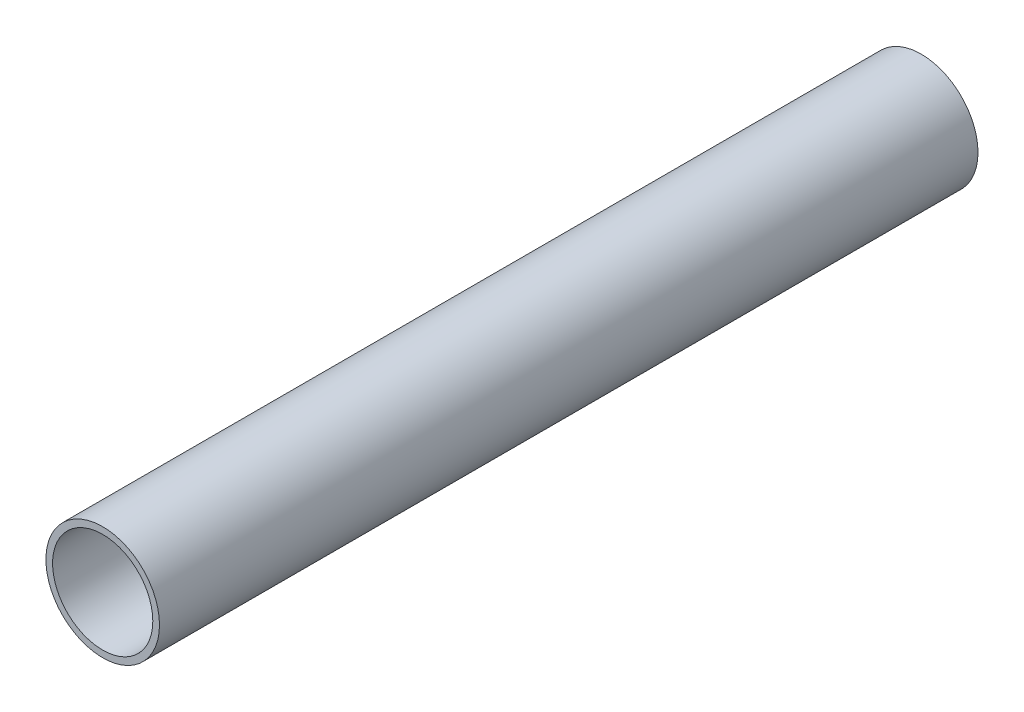
ISO-10303-21;
HEADER;
FILE_DESCRIPTION(('STEP AP214'),'2;1');
FILE_NAME('part.step','',(''),(''),'','','');
FILE_SCHEMA(('AUTOMOTIVE_DESIGN { 1 0 10303 214 1 1 1 1 }'));
ENDSEC;
DATA;
#1=APPLICATION_CONTEXT('core data for automotive mechanical design processes');
#2=APPLICATION_PROTOCOL_DEFINITION('international standard','automotive_design',2000,#1);
#3=PRODUCT_CONTEXT('',#1,'mechanical');
#4=PRODUCT('Part','Part','',(#3));
#5=PRODUCT_RELATED_PRODUCT_CATEGORY('part','',(#4));
#6=PRODUCT_DEFINITION_FORMATION('','',#4);
#7=PRODUCT_DEFINITION_CONTEXT('part definition',#1,'design');
#8=PRODUCT_DEFINITION('design','',#6,#7);
#9=PRODUCT_DEFINITION_SHAPE('','',#8);
#10=(LENGTH_UNIT() NAMED_UNIT(*) SI_UNIT(.MILLI.,.METRE.));
#11=(NAMED_UNIT(*) PLANE_ANGLE_UNIT() SI_UNIT($,.RADIAN.));
#12=(NAMED_UNIT(*) SI_UNIT($,.STERADIAN.) SOLID_ANGLE_UNIT());
#13=UNCERTAINTY_MEASURE_WITH_UNIT(LENGTH_MEASURE(1.E-05),#10,'distance_accuracy_value','');
#14=(GEOMETRIC_REPRESENTATION_CONTEXT(3) GLOBAL_UNCERTAINTY_ASSIGNED_CONTEXT((#13)) GLOBAL_UNIT_ASSIGNED_CONTEXT((#10,
#11,#12)) REPRESENTATION_CONTEXT('',''));
#15=CARTESIAN_POINT('',(0.,0.,0.));
#16=DIRECTION('',(0.,0.,1.));
#17=DIRECTION('',(1.,0.,0.));
#18=AXIS2_PLACEMENT_3D('',#15,#16,#17);
#19=CARTESIAN_POINT('',(0.,0.,122.5));
#20=DIRECTION('',(0.,0.,-1.));
#21=DIRECTION('',(-1.,0.,0.));
#22=AXIS2_PLACEMENT_3D('',#19,#20,#21);
#23=CYLINDRICAL_SURFACE('',#22,15.);
#24=CARTESIAN_POINT('',(0.,0.,122.5));
#25=DIRECTION('',(0.,0.,1.));
#26=DIRECTION('',(1.,0.,0.));
#27=AXIS2_PLACEMENT_3D('',#24,#25,#26);
#28=CIRCLE('',#27,15.);
#29=CARTESIAN_POINT('',(15.,0.,122.5));
#30=VERTEX_POINT('',#29);
#31=EDGE_CURVE('E40',#30,#30,#28,.T.);
#32=ORIENTED_EDGE('',*,*,#31,.T.);
#33=EDGE_LOOP('',(#32));
#34=FACE_BOUND('',#33,.T.);
#35=CARTESIAN_POINT('',(0.,0.,-122.5));
#36=DIRECTION('',(0.,0.,1.));
#37=DIRECTION('',(1.,0.,0.));
#38=AXIS2_PLACEMENT_3D('',#35,#36,#37);
#39=CIRCLE('',#38,15.);
#40=CARTESIAN_POINT('',(15.,0.,-122.5));
#41=VERTEX_POINT('',#40);
#42=EDGE_CURVE('E46',#41,#41,#39,.T.);
#43=ORIENTED_EDGE('',*,*,#42,.F.);
#44=EDGE_LOOP('',(#43));
#45=FACE_BOUND('',#44,.T.);
#46=ADVANCED_FACE('F33',(#34,#45),#23,.F.);
#47=CARTESIAN_POINT('',(0.,0.,122.5));
#48=DIRECTION('',(0.,0.,-1.));
#49=DIRECTION('',(-1.,0.,0.));
#50=AXIS2_PLACEMENT_3D('',#47,#48,#49);
#51=CYLINDRICAL_SURFACE('',#50,17.);
#52=CARTESIAN_POINT('',(0.,0.,122.5));
#53=DIRECTION('',(0.,0.,1.));
#54=DIRECTION('',(1.,0.,0.));
#55=AXIS2_PLACEMENT_3D('',#52,#53,#54);
#56=CIRCLE('',#55,17.);
#57=CARTESIAN_POINT('',(17.,0.,122.5));
#58=VERTEX_POINT('',#57);
#59=EDGE_CURVE('E10',#58,#58,#56,.T.);
#60=ORIENTED_EDGE('',*,*,#59,.F.);
#61=EDGE_LOOP('',(#60));
#62=FACE_BOUND('',#61,.T.);
#63=CARTESIAN_POINT('',(0.,0.,-122.5));
#64=DIRECTION('',(0.,0.,1.));
#65=DIRECTION('',(1.,0.,0.));
#66=AXIS2_PLACEMENT_3D('',#63,#64,#65);
#67=CIRCLE('',#66,17.);
#68=CARTESIAN_POINT('',(17.,0.,-122.5));
#69=VERTEX_POINT('',#68);
#70=EDGE_CURVE('E36',#69,#69,#67,.T.);
#71=ORIENTED_EDGE('',*,*,#70,.T.);
#72=EDGE_LOOP('',(#71));
#73=FACE_BOUND('',#72,.T.);
#74=ADVANCED_FACE('F53',(#62,#73),#51,.T.);
#75=CARTESIAN_POINT('',(0.,0.,122.5));
#76=DIRECTION('',(0.,0.,1.));
#77=DIRECTION('',(1.,0.,0.));
#78=AXIS2_PLACEMENT_3D('',#75,#76,#77);
#79=PLANE('',#78);
#80=ORIENTED_EDGE('',*,*,#31,.F.);
#81=EDGE_LOOP('',(#80));
#82=FACE_BOUND('',#81,.T.);
#83=ORIENTED_EDGE('',*,*,#59,.T.);
#84=EDGE_LOOP('',(#83));
#85=FACE_BOUND('',#84,.T.);
#86=ADVANCED_FACE('F57',(#82,#85),#79,.T.);
#87=CARTESIAN_POINT('',(0.,0.,-122.5));
#88=DIRECTION('',(0.,0.,1.));
#89=DIRECTION('',(1.,0.,0.));
#90=AXIS2_PLACEMENT_3D('',#87,#88,#89);
#91=PLANE('',#90);
#92=ORIENTED_EDGE('',*,*,#42,.T.);
#93=EDGE_LOOP('',(#92));
#94=FACE_BOUND('',#93,.T.);
#95=ORIENTED_EDGE('',*,*,#70,.F.);
#96=EDGE_LOOP('',(#95));
#97=FACE_BOUND('',#96,.T.);
#98=ADVANCED_FACE('F55',(#94,#97),#91,.F.);
#99=CLOSED_SHELL('',(#46,#74,#86,#98));
#100=MANIFOLD_SOLID_BREP('B2',#99);
#101=ADVANCED_BREP_SHAPE_REPRESENTATION('',(#18,#100),#14);
#102=SHAPE_DEFINITION_REPRESENTATION(#9,#101);
ENDSEC;
END-ISO-10303-21;
